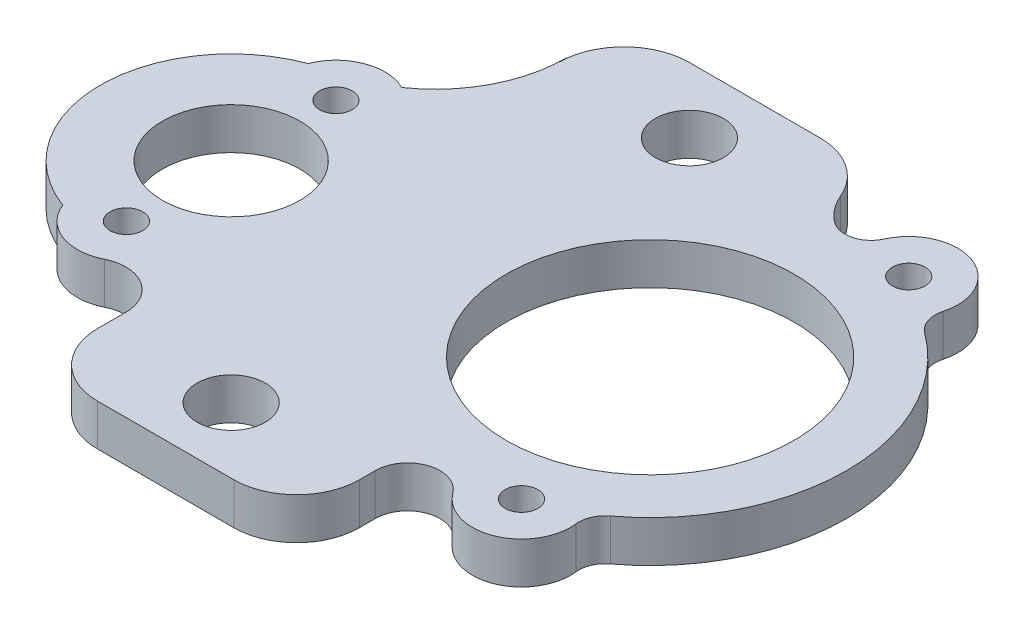
ISO-10303-21;
HEADER;
FILE_DESCRIPTION(('STEP AP214'),'2;1');
FILE_NAME('part.step','',(''),(''),'','','');
FILE_SCHEMA(('AUTOMOTIVE_DESIGN { 1 0 10303 214 1 1 1 1 }'));
ENDSEC;
DATA;
#1=APPLICATION_CONTEXT('core data for automotive mechanical design processes');
#2=APPLICATION_PROTOCOL_DEFINITION('international standard','automotive_design',2000,#1);
#3=PRODUCT_CONTEXT('',#1,'mechanical');
#4=PRODUCT('Part','Part','',(#3));
#5=PRODUCT_RELATED_PRODUCT_CATEGORY('part','',(#4));
#6=PRODUCT_DEFINITION_FORMATION('','',#4);
#7=PRODUCT_DEFINITION_CONTEXT('part definition',#1,'design');
#8=PRODUCT_DEFINITION('design','',#6,#7);
#9=PRODUCT_DEFINITION_SHAPE('','',#8);
#10=(LENGTH_UNIT() NAMED_UNIT(*) SI_UNIT(.MILLI.,.METRE.));
#11=(NAMED_UNIT(*) PLANE_ANGLE_UNIT() SI_UNIT($,.RADIAN.));
#12=(NAMED_UNIT(*) SI_UNIT($,.STERADIAN.) SOLID_ANGLE_UNIT());
#13=UNCERTAINTY_MEASURE_WITH_UNIT(LENGTH_MEASURE(1.E-05),#10,'distance_accuracy_value','');
#14=(GEOMETRIC_REPRESENTATION_CONTEXT(3) GLOBAL_UNCERTAINTY_ASSIGNED_CONTEXT((#13)) GLOBAL_UNIT_ASSIGNED_CONTEXT((#10,
#11,#12)) REPRESENTATION_CONTEXT('',''));
#15=CARTESIAN_POINT('',(0.,0.,0.));
#16=DIRECTION('',(0.,0.,1.));
#17=DIRECTION('',(1.,0.,0.));
#18=AXIS2_PLACEMENT_3D('',#15,#16,#17);
#19=CARTESIAN_POINT('',(14.9999999999998,69.9999999999997,131.043137062059));
#20=DIRECTION('',(0.,0.,-1.));
#21=DIRECTION('',(-1.,0.,0.));
#22=AXIS2_PLACEMENT_3D('',#19,#20,#21);
#23=PLANE('',#22);
#24=DIRECTION('',(-1.,0.,0.));
#25=VECTOR('',#24,1.);
#26=CARTESIAN_POINT('',(14.9999999999998,69.9999999999997,131.043137062059));
#27=LINE('',#26,#25);
#28=CARTESIAN_POINT('',(14.9999999999998,69.9999999999997,131.043137062059));
#29=VERTEX_POINT('',#28);
#30=CARTESIAN_POINT('',(4.99999999999983,69.9999999999997,131.043137062059));
#31=VERTEX_POINT('',#30);
#32=EDGE_CURVE('E678',#29,#31,#27,.T.);
#33=ORIENTED_EDGE('',*,*,#32,.T.);
#34=DIRECTION('',(0.,-1.,0.));
#35=VECTOR('',#34,1.);
#36=CARTESIAN_POINT('',(4.99999999999983,73.1749999999997,131.043137062059));
#37=LINE('',#36,#35);
#38=CARTESIAN_POINT('',(4.99999999999983,73.1749999999997,131.043137062059));
#39=VERTEX_POINT('',#38);
#40=EDGE_CURVE('E214',#39,#31,#37,.T.);
#41=ORIENTED_EDGE('',*,*,#40,.F.);
#42=DIRECTION('',(-1.,0.,0.));
#43=VECTOR('',#42,1.);
#44=CARTESIAN_POINT('',(14.9999999999998,73.1749999999996,131.043137062059));
#45=LINE('',#44,#43);
#46=CARTESIAN_POINT('',(14.9999999999998,73.1749999999996,131.043137062059));
#47=VERTEX_POINT('',#46);
#48=EDGE_CURVE('E213',#47,#39,#45,.T.);
#49=ORIENTED_EDGE('',*,*,#48,.F.);
#50=DIRECTION('',(0.,1.,0.));
#51=VECTOR('',#50,1.);
#52=CARTESIAN_POINT('',(14.9999999999998,69.9999999999997,131.043137062059));
#53=LINE('',#52,#51);
#54=EDGE_CURVE('E36',#29,#47,#53,.T.);
#55=ORIENTED_EDGE('',*,*,#54,.F.);
#56=EDGE_LOOP('',(#33,#41,#49,#55));
#57=FACE_BOUND('',#56,.T.);
#58=ADVANCED_FACE('F32',(#57),#23,.T.);
#59=CARTESIAN_POINT('',(14.9999999999998,69.9999999999997,136.043137062059));
#60=DIRECTION('',(0.,1.,0.));
#61=DIRECTION('',(0.,0.,1.));
#62=AXIS2_PLACEMENT_3D('',#59,#60,#61);
#63=CYLINDRICAL_SURFACE('',#62,5.00000000000006);
#64=CARTESIAN_POINT('',(14.9999999999998,73.1749999999996,136.043137062059));
#65=DIRECTION('',(0.,1.,0.));
#66=DIRECTION('',(0.,0.,1.));
#67=AXIS2_PLACEMENT_3D('',#64,#65,#66);
#68=CIRCLE('',#67,5.00000000000006);
#69=CARTESIAN_POINT('',(19.6147076746497,73.1749999999996,134.118436285958));
#70=VERTEX_POINT('',#69);
#71=EDGE_CURVE('E210',#70,#47,#68,.T.);
#72=ORIENTED_EDGE('',*,*,#71,.F.);
#73=DIRECTION('',(0.,1.,0.));
#74=VECTOR('',#73,1.);
#75=CARTESIAN_POINT('',(19.6147076746497,69.9999999999997,134.118436285958));
#76=LINE('',#75,#74);
#77=CARTESIAN_POINT('',(19.6147076746497,69.9999999999997,134.118436285958));
#78=VERTEX_POINT('',#77);
#79=EDGE_CURVE('E11',#78,#70,#76,.T.);
#80=ORIENTED_EDGE('',*,*,#79,.F.);
#81=CARTESIAN_POINT('',(14.9999999999998,69.9999999999997,136.043137062059));
#82=DIRECTION('',(0.,1.,0.));
#83=DIRECTION('',(0.,0.,1.));
#84=AXIS2_PLACEMENT_3D('',#81,#82,#83);
#85=CIRCLE('',#84,5.00000000000006);
#86=EDGE_CURVE('E266',#78,#29,#85,.T.);
#87=ORIENTED_EDGE('',*,*,#86,.T.);
#88=ORIENTED_EDGE('',*,*,#54,.T.);
#89=EDGE_LOOP('',(#72,#80,#87,#88));
#90=FACE_BOUND('',#89,.T.);
#91=ADVANCED_FACE('F34',(#90),#63,.T.);
#92=CARTESIAN_POINT('',(24.0448270423146,69.9999999999997,132.270723540901));
#93=DIRECTION('',(0.,1.,0.));
#94=DIRECTION('',(0.,0.,1.));
#95=AXIS2_PLACEMENT_3D('',#92,#93,#94);
#96=CYLINDRICAL_SURFACE('',#95,4.80000000000066);
#97=CARTESIAN_POINT('',(24.0448270423146,73.1749999999996,132.270723540901));
#98=DIRECTION('',(0.,-1.,0.));
#99=DIRECTION('',(0.,0.,-1.));
#100=AXIS2_PLACEMENT_3D('',#97,#98,#99);
#101=CIRCLE('',#100,4.80000000000066);
#102=CARTESIAN_POINT('',(21.0461776652767,73.1749999999996,136.018803304407));
#103=VERTEX_POINT('',#102);
#104=EDGE_CURVE('E264',#103,#70,#101,.T.);
#105=ORIENTED_EDGE('',*,*,#104,.F.);
#106=DIRECTION('',(0.,1.,0.));
#107=VECTOR('',#106,1.);
#108=CARTESIAN_POINT('',(21.0461776652767,69.9999999999997,136.018803304407));
#109=LINE('',#108,#107);
#110=CARTESIAN_POINT('',(21.0461776652767,69.9999999999997,136.018803304407));
#111=VERTEX_POINT('',#110);
#112=EDGE_CURVE('E41',#111,#103,#109,.T.);
#113=ORIENTED_EDGE('',*,*,#112,.F.);
#114=CARTESIAN_POINT('',(24.0448270423146,69.9999999999997,132.270723540901));
#115=DIRECTION('',(0.,-1.,0.));
#116=DIRECTION('',(0.,0.,-1.));
#117=AXIS2_PLACEMENT_3D('',#114,#115,#116);
#118=CIRCLE('',#117,4.80000000000066);
#119=EDGE_CURVE('E200',#111,#78,#118,.T.);
#120=ORIENTED_EDGE('',*,*,#119,.T.);
#121=ORIENTED_EDGE('',*,*,#79,.T.);
#122=EDGE_LOOP('',(#105,#113,#120,#121));
#123=FACE_BOUND('',#122,.T.);
#124=ADVANCED_FACE('F306',(#123),#96,.F.);
#125=CARTESIAN_POINT('',(22.2956149057087,69.9999999999997,134.457103402946));
#126=DIRECTION('',(0.,1.,0.));
#127=DIRECTION('',(0.,0.,1.));
#128=AXIS2_PLACEMENT_3D('',#125,#126,#127);
#129=CYLINDRICAL_SURFACE('',#128,2.00000000000011);
#130=CARTESIAN_POINT('',(22.2956149057087,73.1749999999996,134.457103402946));
#131=DIRECTION('',(0.,-1.,0.));
#132=DIRECTION('',(0.,0.,-1.));
#133=AXIS2_PLACEMENT_3D('',#130,#131,#132);
#134=CIRCLE('',#133,2.00000000000011);
#135=CARTESIAN_POINT('',(24.1176951087348,73.1749999999996,135.281738918638));
#136=VERTEX_POINT('',#135);
#137=EDGE_CURVE('E186',#136,#103,#134,.T.);
#138=ORIENTED_EDGE('',*,*,#137,.F.);
#139=DIRECTION('',(0.,1.,0.));
#140=VECTOR('',#139,1.);
#141=CARTESIAN_POINT('',(24.1176951087348,69.9999999999997,135.281738918638));
#142=LINE('',#141,#140);
#143=CARTESIAN_POINT('',(24.1176951087348,69.9999999999997,135.281738918638));
#144=VERTEX_POINT('',#143);
#145=EDGE_CURVE('E180',#144,#136,#142,.T.);
#146=ORIENTED_EDGE('',*,*,#145,.F.);
#147=CARTESIAN_POINT('',(22.2956149057087,69.9999999999997,134.457103402946));
#148=DIRECTION('',(0.,-1.,0.));
#149=DIRECTION('',(0.,0.,-1.));
#150=AXIS2_PLACEMENT_3D('',#147,#148,#149);
#151=CIRCLE('',#150,2.00000000000011);
#152=EDGE_CURVE('E183',#144,#111,#151,.T.);
#153=ORIENTED_EDGE('',*,*,#152,.T.);
#154=ORIENTED_EDGE('',*,*,#112,.T.);
#155=EDGE_LOOP('',(#138,#146,#153,#154));
#156=FACE_BOUND('',#155,.T.);
#157=ADVANCED_FACE('F182',(#156),#129,.F.);
#158=CARTESIAN_POINT('',(27.5340954894091,69.9999999999997,136.827930510559));
#159=DIRECTION('',(0.,1.,0.));
#160=DIRECTION('',(0.,0.,1.));
#161=AXIS2_PLACEMENT_3D('',#158,#159,#160);
#162=CYLINDRICAL_SURFACE('',#161,3.74999999999996);
#163=CARTESIAN_POINT('',(27.5340954894091,73.1749999999996,136.827930510559));
#164=DIRECTION('',(0.,1.,0.));
#165=DIRECTION('',(0.,0.,1.));
#166=AXIS2_PLACEMENT_3D('',#163,#164,#165);
#167=CIRCLE('',#166,3.74999999999996);
#168=CARTESIAN_POINT('',(31.1498493593787,73.1749999999996,137.822326785593));
#169=VERTEX_POINT('',#168);
#170=EDGE_CURVE('E261',#169,#136,#167,.T.);
#171=ORIENTED_EDGE('',*,*,#170,.F.);
#172=DIRECTION('',(0.,1.,0.));
#173=VECTOR('',#172,1.);
#174=CARTESIAN_POINT('',(31.1498493593787,69.9999999999997,137.822326785593));
#175=LINE('',#174,#173);
#176=CARTESIAN_POINT('',(31.1498493593787,69.9999999999997,137.822326785593));
#177=VERTEX_POINT('',#176);
#178=EDGE_CURVE('E191',#177,#169,#175,.T.);
#179=ORIENTED_EDGE('',*,*,#178,.F.);
#180=CARTESIAN_POINT('',(27.5340954894091,69.9999999999997,136.827930510559));
#181=DIRECTION('',(0.,1.,0.));
#182=DIRECTION('',(0.,0.,1.));
#183=AXIS2_PLACEMENT_3D('',#180,#181,#182);
#184=CIRCLE('',#183,3.74999999999996);
#185=EDGE_CURVE('E198',#177,#144,#184,.T.);
#186=ORIENTED_EDGE('',*,*,#185,.T.);
#187=ORIENTED_EDGE('',*,*,#145,.T.);
#188=EDGE_LOOP('',(#171,#179,#186,#187));
#189=FACE_BOUND('',#188,.T.);
#190=ADVANCED_FACE('F202',(#189),#162,.T.);
#191=CARTESIAN_POINT('',(33.0782514233622,69.9999999999997,138.352671465612));
#192=DIRECTION('',(0.,1.,0.));
#193=DIRECTION('',(0.,0.,1.));
#194=AXIS2_PLACEMENT_3D('',#191,#192,#193);
#195=CYLINDRICAL_SURFACE('',#194,1.99999999999997);
#196=CARTESIAN_POINT('',(33.0782514233622,73.1749999999996,138.352671465612));
#197=DIRECTION('',(0.,-1.,0.));
#198=DIRECTION('',(0.,0.,-1.));
#199=AXIS2_PLACEMENT_3D('',#196,#197,#198);
#200=CIRCLE('',#199,1.99999999999997);
#201=CARTESIAN_POINT('',(31.8925747853198,73.1749999999996,139.963314476958));
#202=VERTEX_POINT('',#201);
#203=EDGE_CURVE('E258',#202,#169,#200,.T.);
#204=ORIENTED_EDGE('',*,*,#203,.F.);
#205=DIRECTION('',(0.,1.,0.));
#206=VECTOR('',#205,1.);
#207=CARTESIAN_POINT('',(31.8925747853198,69.9999999999997,139.963314476958));
#208=LINE('',#207,#206);
#209=CARTESIAN_POINT('',(31.8925747853198,69.9999999999997,139.963314476958));
#210=VERTEX_POINT('',#209);
#211=EDGE_CURVE('E270',#210,#202,#208,.T.);
#212=ORIENTED_EDGE('',*,*,#211,.F.);
#213=CARTESIAN_POINT('',(33.0782514233622,69.9999999999997,138.352671465612));
#214=DIRECTION('',(0.,-1.,0.));
#215=DIRECTION('',(0.,0.,-1.));
#216=AXIS2_PLACEMENT_3D('',#213,#214,#215);
#217=CIRCLE('',#216,1.99999999999997);
#218=EDGE_CURVE('E203',#210,#177,#217,.T.);
#219=ORIENTED_EDGE('',*,*,#218,.T.);
#220=ORIENTED_EDGE('',*,*,#178,.T.);
#221=EDGE_LOOP('',(#204,#212,#219,#220));
#222=FACE_BOUND('',#221,.T.);
#223=ADVANCED_FACE('F373',(#222),#195,.F.);
#224=CARTESIAN_POINT('',(22.9999999999999,69.9999999999997,152.043137062058));
#225=DIRECTION('',(0.,1.,0.));
#226=DIRECTION('',(0.,0.,1.));
#227=AXIS2_PLACEMENT_3D('',#224,#225,#226);
#228=CYLINDRICAL_SURFACE('',#227,14.9999999999999);
#229=CARTESIAN_POINT('',(22.9999999999999,73.1749999999996,152.043137062058));
#230=DIRECTION('',(0.,1.,0.));
#231=DIRECTION('',(0.,0.,1.));
#232=AXIS2_PLACEMENT_3D('',#229,#230,#231);
#233=CIRCLE('',#232,14.9999999999999);
#234=CARTESIAN_POINT('',(31.9786986541308,73.1749999999996,164.059083569858));
#235=VERTEX_POINT('',#234);
#236=EDGE_CURVE('E255',#235,#202,#233,.T.);
#237=ORIENTED_EDGE('',*,*,#236,.F.);
#238=DIRECTION('',(0.,1.,0.));
#239=VECTOR('',#238,1.);
#240=CARTESIAN_POINT('',(31.9786986541308,69.9999999999997,164.059083569858));
#241=LINE('',#240,#239);
#242=CARTESIAN_POINT('',(31.9786986541308,69.9999999999997,164.059083569858));
#243=VERTEX_POINT('',#242);
#244=EDGE_CURVE('E272',#243,#235,#241,.T.);
#245=ORIENTED_EDGE('',*,*,#244,.F.);
#246=CARTESIAN_POINT('',(22.9999999999999,69.9999999999997,152.043137062058));
#247=DIRECTION('',(0.,1.,0.));
#248=DIRECTION('',(0.,0.,1.));
#249=AXIS2_PLACEMENT_3D('',#246,#247,#248);
#250=CIRCLE('',#249,14.9999999999999);
#251=EDGE_CURVE('E205',#243,#210,#250,.T.);
#252=ORIENTED_EDGE('',*,*,#251,.T.);
#253=ORIENTED_EDGE('',*,*,#211,.T.);
#254=EDGE_LOOP('',(#237,#245,#252,#253));
#255=FACE_BOUND('',#254,.T.);
#256=ADVANCED_FACE('F369',(#255),#228,.T.);
#257=CARTESIAN_POINT('',(33.1758584746817,69.9999999999997,165.661209770898));
#258=DIRECTION('',(0.,1.,0.));
#259=DIRECTION('',(0.,0.,1.));
#260=AXIS2_PLACEMENT_3D('',#257,#258,#259);
#261=CYLINDRICAL_SURFACE('',#260,2.00000000000009);
#262=CARTESIAN_POINT('',(33.1758584746817,73.1749999999996,165.661209770898));
#263=DIRECTION('',(0.,-1.,0.));
#264=DIRECTION('',(0.,0.,-1.));
#265=AXIS2_PLACEMENT_3D('',#262,#263,#264);
#266=CIRCLE('',#265,2.00000000000009);
#267=CARTESIAN_POINT('',(31.1894987713888,73.1749999999996,165.894394524121));
#268=VERTEX_POINT('',#267);
#269=EDGE_CURVE('E252',#268,#235,#266,.T.);
#270=ORIENTED_EDGE('',*,*,#269,.F.);
#271=DIRECTION('',(0.,1.,0.));
#272=VECTOR('',#271,1.);
#273=CARTESIAN_POINT('',(31.1894987713888,69.9999999999997,165.894394524121));
#274=LINE('',#273,#272);
#275=CARTESIAN_POINT('',(31.1894987713888,69.9999999999997,165.894394524121));
#276=VERTEX_POINT('',#275);
#277=EDGE_CURVE('E274',#276,#268,#274,.T.);
#278=ORIENTED_EDGE('',*,*,#277,.F.);
#279=CARTESIAN_POINT('',(33.1758584746817,69.9999999999997,165.661209770898));
#280=DIRECTION('',(0.,-1.,0.));
#281=DIRECTION('',(0.,0.,-1.));
#282=AXIS2_PLACEMENT_3D('',#279,#280,#281);
#283=CIRCLE('',#282,2.00000000000009);
#284=EDGE_CURVE('E715',#276,#243,#283,.T.);
#285=ORIENTED_EDGE('',*,*,#284,.T.);
#286=ORIENTED_EDGE('',*,*,#244,.T.);
#287=EDGE_LOOP('',(#270,#278,#285,#286));
#288=FACE_BOUND('',#287,.T.);
#289=ADVANCED_FACE('F365',(#288),#261,.F.);
#290=CARTESIAN_POINT('',(27.4650743277155,69.9999999999997,166.331615936413));
#291=DIRECTION('',(0.,1.,0.));
#292=DIRECTION('',(0.,0.,1.));
#293=AXIS2_PLACEMENT_3D('',#290,#291,#292);
#294=CYLINDRICAL_SURFACE('',#293,3.74999999999975);
#295=CARTESIAN_POINT('',(27.4650743277155,73.1749999999996,166.331615936413));
#296=DIRECTION('',(0.,1.,0.));
#297=DIRECTION('',(0.,0.,1.));
#298=AXIS2_PLACEMENT_3D('',#295,#296,#297);
#299=CIRCLE('',#298,3.74999999999975);
#300=CARTESIAN_POINT('',(24.4525362051228,73.1749999999996,168.564800671253));
#301=VERTEX_POINT('',#300);
#302=EDGE_CURVE('E249',#301,#268,#299,.T.);
#303=ORIENTED_EDGE('',*,*,#302,.F.);
#304=DIRECTION('',(0.,1.,0.));
#305=VECTOR('',#304,1.);
#306=CARTESIAN_POINT('',(24.4525362051228,69.9999999999997,168.564800671253));
#307=LINE('',#306,#305);
#308=CARTESIAN_POINT('',(24.4525362051228,69.9999999999997,168.564800671253));
#309=VERTEX_POINT('',#308);
#310=EDGE_CURVE('E276',#309,#301,#307,.T.);
#311=ORIENTED_EDGE('',*,*,#310,.F.);
#312=CARTESIAN_POINT('',(27.4650743277155,69.9999999999997,166.331615936413));
#313=DIRECTION('',(0.,1.,0.));
#314=DIRECTION('',(0.,0.,1.));
#315=AXIS2_PLACEMENT_3D('',#312,#313,#314);
#316=CIRCLE('',#315,3.74999999999975);
#317=EDGE_CURVE('E712',#309,#276,#316,.T.);
#318=ORIENTED_EDGE('',*,*,#317,.T.);
#319=ORIENTED_EDGE('',*,*,#277,.T.);
#320=EDGE_LOOP('',(#303,#311,#318,#319));
#321=FACE_BOUND('',#320,.T.);
#322=ADVANCED_FACE('F361',(#321),#294,.T.);
#323=CARTESIAN_POINT('',(22.4689677153948,69.9999999999997,170.035213556173));
#324=DIRECTION('',(0.,1.,0.));
#325=DIRECTION('',(0.,0.,1.));
#326=AXIS2_PLACEMENT_3D('',#323,#324,#325);
#327=CYLINDRICAL_SURFACE('',#326,2.46914114735876);
#328=CARTESIAN_POINT('',(22.4689677153948,73.1749999999996,170.035213556173));
#329=DIRECTION('',(0.,-1.,0.));
#330=DIRECTION('',(0.,0.,-1.));
#331=AXIS2_PLACEMENT_3D('',#328,#329,#330);
#332=CIRCLE('',#331,2.46914114735876);
#333=CARTESIAN_POINT('',(19.9999999999997,73.1749999999996,170.064478311714));
#334=VERTEX_POINT('',#333);
#335=EDGE_CURVE('E246',#334,#301,#332,.T.);
#336=ORIENTED_EDGE('',*,*,#335,.F.);
#337=DIRECTION('',(0.,1.,0.));
#338=VECTOR('',#337,1.);
#339=CARTESIAN_POINT('',(19.9999999999997,69.9999999999997,170.064478311714));
#340=LINE('',#339,#338);
#341=CARTESIAN_POINT('',(19.9999999999997,69.9999999999997,170.064478311714));
#342=VERTEX_POINT('',#341);
#343=EDGE_CURVE('E278',#342,#334,#340,.T.);
#344=ORIENTED_EDGE('',*,*,#343,.F.);
#345=CARTESIAN_POINT('',(22.4689677153948,69.9999999999997,170.035213556173));
#346=DIRECTION('',(0.,-1.,0.));
#347=DIRECTION('',(0.,0.,-1.));
#348=AXIS2_PLACEMENT_3D('',#345,#346,#347);
#349=CIRCLE('',#348,2.46914114735876);
#350=EDGE_CURVE('E709',#342,#309,#349,.T.);
#351=ORIENTED_EDGE('',*,*,#350,.T.);
#352=ORIENTED_EDGE('',*,*,#310,.T.);
#353=EDGE_LOOP('',(#336,#344,#351,#352));
#354=FACE_BOUND('',#353,.T.);
#355=ADVANCED_FACE('F357',(#354),#327,.F.);
#356=CARTESIAN_POINT('',(19.9999999999998,69.9999999999997,171.243137062062));
#357=DIRECTION('',(1.,0.,0.));
#358=DIRECTION('',(0.,0.,-1.));
#359=AXIS2_PLACEMENT_3D('',#356,#357,#358);
#360=PLANE('',#359);
#361=DIRECTION('',(0.,0.,-1.));
#362=VECTOR('',#361,1.);
#363=CARTESIAN_POINT('',(19.9999999999998,73.1749999999996,171.243137062062));
#364=LINE('',#363,#362);
#365=CARTESIAN_POINT('',(19.9999999999998,73.1749999999996,171.243137062062));
#366=VERTEX_POINT('',#365);
#367=EDGE_CURVE('E243',#366,#334,#364,.T.);
#368=ORIENTED_EDGE('',*,*,#367,.F.);
#369=DIRECTION('',(0.,1.,0.));
#370=VECTOR('',#369,1.);
#371=CARTESIAN_POINT('',(19.9999999999998,69.9999999999997,171.243137062062));
#372=LINE('',#371,#370);
#373=CARTESIAN_POINT('',(19.9999999999998,69.9999999999997,171.243137062062));
#374=VERTEX_POINT('',#373);
#375=EDGE_CURVE('E280',#374,#366,#372,.T.);
#376=ORIENTED_EDGE('',*,*,#375,.F.);
#377=DIRECTION('',(0.,0.,-1.));
#378=VECTOR('',#377,1.);
#379=CARTESIAN_POINT('',(19.9999999999998,69.9999999999997,171.243137062062));
#380=LINE('',#379,#378);
#381=EDGE_CURVE('E706',#374,#342,#380,.T.);
#382=ORIENTED_EDGE('',*,*,#381,.T.);
#383=ORIENTED_EDGE('',*,*,#343,.T.);
#384=EDGE_LOOP('',(#368,#376,#382,#383));
#385=FACE_BOUND('',#384,.T.);
#386=ADVANCED_FACE('F353',(#385),#360,.T.);
#387=CARTESIAN_POINT('',(15.1999999999998,69.9999999999997,171.243137062062));
#388=DIRECTION('',(0.,1.,0.));
#389=DIRECTION('',(0.,0.,1.));
#390=AXIS2_PLACEMENT_3D('',#387,#388,#389);
#391=CYLINDRICAL_SURFACE('',#390,4.8);
#392=CARTESIAN_POINT('',(15.1999999999998,73.1749999999996,171.243137062062));
#393=DIRECTION('',(0.,1.,0.));
#394=DIRECTION('',(0.,0.,1.));
#395=AXIS2_PLACEMENT_3D('',#392,#393,#394);
#396=CIRCLE('',#395,4.8);
#397=CARTESIAN_POINT('',(15.1999999999998,73.1749999999996,176.043137062062));
#398=VERTEX_POINT('',#397);
#399=EDGE_CURVE('E240',#398,#366,#396,.T.);
#400=ORIENTED_EDGE('',*,*,#399,.F.);
#401=DIRECTION('',(0.,1.,0.));
#402=VECTOR('',#401,1.);
#403=CARTESIAN_POINT('',(15.1999999999998,69.9999999999997,176.043137062062));
#404=LINE('',#403,#402);
#405=CARTESIAN_POINT('',(15.1999999999998,69.9999999999997,176.043137062062));
#406=VERTEX_POINT('',#405);
#407=EDGE_CURVE('E282',#406,#398,#404,.T.);
#408=ORIENTED_EDGE('',*,*,#407,.F.);
#409=CARTESIAN_POINT('',(15.1999999999998,69.9999999999997,171.243137062062));
#410=DIRECTION('',(0.,1.,0.));
#411=DIRECTION('',(0.,0.,1.));
#412=AXIS2_PLACEMENT_3D('',#409,#410,#411);
#413=CIRCLE('',#412,4.8);
#414=EDGE_CURVE('E703',#406,#374,#413,.T.);
#415=ORIENTED_EDGE('',*,*,#414,.T.);
#416=ORIENTED_EDGE('',*,*,#375,.T.);
#417=EDGE_LOOP('',(#400,#408,#415,#416));
#418=FACE_BOUND('',#417,.T.);
#419=ADVANCED_FACE('F349',(#418),#391,.T.);
#420=CARTESIAN_POINT('',(4.79999999999983,69.9999999999997,176.043137062062));
#421=DIRECTION('',(0.,0.,1.));
#422=DIRECTION('',(1.,0.,0.));
#423=AXIS2_PLACEMENT_3D('',#420,#421,#422);
#424=PLANE('',#423);
#425=DIRECTION('',(1.,0.,0.));
#426=VECTOR('',#425,1.);
#427=CARTESIAN_POINT('',(4.79999999999983,73.1749999999996,176.043137062062));
#428=LINE('',#427,#426);
#429=CARTESIAN_POINT('',(4.79999999999983,73.1749999999996,176.043137062062));
#430=VERTEX_POINT('',#429);
#431=EDGE_CURVE('E237',#430,#398,#428,.T.);
#432=ORIENTED_EDGE('',*,*,#431,.F.);
#433=DIRECTION('',(0.,1.,0.));
#434=VECTOR('',#433,1.);
#435=CARTESIAN_POINT('',(4.79999999999983,69.9999999999997,176.043137062062));
#436=LINE('',#435,#434);
#437=CARTESIAN_POINT('',(4.79999999999983,69.9999999999997,176.043137062062));
#438=VERTEX_POINT('',#437);
#439=EDGE_CURVE('E284',#438,#430,#436,.T.);
#440=ORIENTED_EDGE('',*,*,#439,.F.);
#441=DIRECTION('',(1.,0.,0.));
#442=VECTOR('',#441,1.);
#443=CARTESIAN_POINT('',(4.79999999999983,69.9999999999997,176.043137062062));
#444=LINE('',#443,#442);
#445=EDGE_CURVE('E700',#438,#406,#444,.T.);
#446=ORIENTED_EDGE('',*,*,#445,.T.);
#447=ORIENTED_EDGE('',*,*,#407,.T.);
#448=EDGE_LOOP('',(#432,#440,#446,#447));
#449=FACE_BOUND('',#448,.T.);
#450=ADVANCED_FACE('F345',(#449),#424,.T.);
#451=CARTESIAN_POINT('',(4.79999999999982,69.9999999999997,171.243137062062));
#452=DIRECTION('',(0.,1.,0.));
#453=DIRECTION('',(0.,0.,1.));
#454=AXIS2_PLACEMENT_3D('',#451,#452,#453);
#455=CYLINDRICAL_SURFACE('',#454,4.8);
#456=CARTESIAN_POINT('',(4.79999999999982,73.1749999999996,171.243137062062));
#457=DIRECTION('',(0.,1.,0.));
#458=DIRECTION('',(0.,0.,1.));
#459=AXIS2_PLACEMENT_3D('',#456,#457,#458);
#460=CIRCLE('',#459,4.8);
#461=CARTESIAN_POINT('',(-1.75207071073658E-13,73.1749999999996,171.243137062062));
#462=VERTEX_POINT('',#461);
#463=EDGE_CURVE('E234',#462,#430,#460,.T.);
#464=ORIENTED_EDGE('',*,*,#463,.F.);
#465=DIRECTION('',(0.,1.,0.));
#466=VECTOR('',#465,1.);
#467=CARTESIAN_POINT('',(-1.75207071073658E-13,69.9999999999997,171.243137062062));
#468=LINE('',#467,#466);
#469=CARTESIAN_POINT('',(-1.75207071073658E-13,69.9999999999997,171.243137062062));
#470=VERTEX_POINT('',#469);
#471=EDGE_CURVE('E286',#470,#462,#468,.T.);
#472=ORIENTED_EDGE('',*,*,#471,.F.);
#473=CARTESIAN_POINT('',(4.79999999999982,69.9999999999997,171.243137062062));
#474=DIRECTION('',(0.,1.,0.));
#475=DIRECTION('',(0.,0.,1.));
#476=AXIS2_PLACEMENT_3D('',#473,#474,#475);
#477=CIRCLE('',#476,4.8);
#478=EDGE_CURVE('E697',#470,#438,#477,.T.);
#479=ORIENTED_EDGE('',*,*,#478,.T.);
#480=ORIENTED_EDGE('',*,*,#439,.T.);
#481=EDGE_LOOP('',(#464,#472,#479,#480));
#482=FACE_BOUND('',#481,.T.);
#483=ADVANCED_FACE('F341',(#482),#455,.T.);
#484=CARTESIAN_POINT('',(-1.73116729285106E-13,69.9999999999997,169.066324625279));
#485=DIRECTION('',(-1.,0.,0.));
#486=DIRECTION('',(0.,0.,1.));
#487=AXIS2_PLACEMENT_3D('',#484,#485,#486);
#488=PLANE('',#487);
#489=DIRECTION('',(0.,0.,1.));
#490=VECTOR('',#489,1.);
#491=CARTESIAN_POINT('',(-1.73116729285106E-13,73.1749999999996,169.066324625279));
#492=LINE('',#491,#490);
#493=CARTESIAN_POINT('',(-1.68701858038744E-13,73.1749999999996,169.066324625279));
#494=VERTEX_POINT('',#493);
#495=EDGE_CURVE('E231',#494,#462,#492,.T.);
#496=ORIENTED_EDGE('',*,*,#495,.F.);
#497=DIRECTION('',(0.,1.,0.));
#498=VECTOR('',#497,1.);
#499=CARTESIAN_POINT('',(-1.68701858038744E-13,69.9999999999997,169.066324625279));
#500=LINE('',#499,#498);
#501=CARTESIAN_POINT('',(-1.68701858038744E-13,69.9999999999997,169.066324625279));
#502=VERTEX_POINT('',#501);
#503=EDGE_CURVE('E288',#502,#494,#500,.T.);
#504=ORIENTED_EDGE('',*,*,#503,.F.);
#505=DIRECTION('',(0.,0.,1.));
#506=VECTOR('',#505,1.);
#507=CARTESIAN_POINT('',(-1.73116729285106E-13,69.9999999999997,169.066324625279));
#508=LINE('',#507,#506);
#509=EDGE_CURVE('E694',#502,#470,#508,.T.);
#510=ORIENTED_EDGE('',*,*,#509,.T.);
#511=ORIENTED_EDGE('',*,*,#471,.T.);
#512=EDGE_LOOP('',(#496,#504,#510,#511));
#513=FACE_BOUND('',#512,.T.);
#514=ADVANCED_FACE('F337',(#513),#488,.T.);
#515=CARTESIAN_POINT('',(-2.99700866872108,69.9999999999997,169.08507053944));
#516=DIRECTION('',(0.,1.,0.));
#517=DIRECTION('',(0.,0.,1.));
#518=AXIS2_PLACEMENT_3D('',#515,#516,#517);
#519=CYLINDRICAL_SURFACE('',#518,2.99706729482106);
#520=CARTESIAN_POINT('',(-2.99700866872108,73.1749999999996,169.08507053944));
#521=DIRECTION('',(0.,-1.,0.));
#522=DIRECTION('',(0.,0.,-1.));
#523=AXIS2_PLACEMENT_3D('',#520,#521,#522);
#524=CIRCLE('',#523,2.99706729482106);
#525=CARTESIAN_POINT('',(-4.33094632079063,73.1749999999996,166.401225776776));
#526=VERTEX_POINT('',#525);
#527=EDGE_CURVE('E228',#526,#494,#524,.T.);
#528=ORIENTED_EDGE('',*,*,#527,.F.);
#529=DIRECTION('',(0.,1.,0.));
#530=VECTOR('',#529,1.);
#531=CARTESIAN_POINT('',(-4.33094632079063,69.9999999999997,166.401225776776));
#532=LINE('',#531,#530);
#533=CARTESIAN_POINT('',(-4.33094632079063,69.9999999999997,166.401225776776));
#534=VERTEX_POINT('',#533);
#535=EDGE_CURVE('E290',#534,#526,#532,.T.);
#536=ORIENTED_EDGE('',*,*,#535,.F.);
#537=CARTESIAN_POINT('',(-2.99700866872108,69.9999999999997,169.08507053944));
#538=DIRECTION('',(0.,-1.,0.));
#539=DIRECTION('',(0.,0.,-1.));
#540=AXIS2_PLACEMENT_3D('',#537,#538,#539);
#541=CIRCLE('',#540,2.99706729482106);
#542=EDGE_CURVE('E691',#534,#502,#541,.T.);
#543=ORIENTED_EDGE('',*,*,#542,.T.);
#544=ORIENTED_EDGE('',*,*,#503,.T.);
#545=EDGE_LOOP('',(#528,#536,#543,#544));
#546=FACE_BOUND('',#545,.T.);
#547=ADVANCED_FACE('F333',(#546),#519,.F.);
#548=CARTESIAN_POINT('',(-6.00000000000038,69.9999999999997,163.043137062058));
#549=DIRECTION('',(0.,1.,0.));
#550=DIRECTION('',(0.,0.,1.));
#551=AXIS2_PLACEMENT_3D('',#548,#549,#550);
#552=CYLINDRICAL_SURFACE('',#551,3.75000000000028);
#553=CARTESIAN_POINT('',(-6.00000000000038,73.1749999999996,163.043137062058));
#554=DIRECTION('',(0.,1.,0.));
#555=DIRECTION('',(0.,0.,1.));
#556=AXIS2_PLACEMENT_3D('',#553,#554,#555);
#557=CIRCLE('',#556,3.75000000000028);
#558=CARTESIAN_POINT('',(-9.49035842410423,73.1749999999996,164.414230812058));
#559=VERTEX_POINT('',#558);
#560=EDGE_CURVE('E225',#559,#526,#557,.T.);
#561=ORIENTED_EDGE('',*,*,#560,.F.);
#562=DIRECTION('',(0.,1.,0.));
#563=VECTOR('',#562,1.);
#564=CARTESIAN_POINT('',(-9.49035842410423,69.9999999999997,164.414230812058));
#565=LINE('',#564,#563);
#566=CARTESIAN_POINT('',(-9.49035842410423,69.9999999999997,164.414230812058));
#567=VERTEX_POINT('',#566);
#568=EDGE_CURVE('E292',#567,#559,#565,.T.);
#569=ORIENTED_EDGE('',*,*,#568,.F.);
#570=CARTESIAN_POINT('',(-6.00000000000038,69.9999999999997,163.043137062058));
#571=DIRECTION('',(0.,1.,0.));
#572=DIRECTION('',(0.,0.,1.));
#573=AXIS2_PLACEMENT_3D('',#570,#571,#572);
#574=CIRCLE('',#573,3.75000000000028);
#575=EDGE_CURVE('E688',#567,#534,#574,.T.);
#576=ORIENTED_EDGE('',*,*,#575,.T.);
#577=ORIENTED_EDGE('',*,*,#535,.T.);
#578=EDGE_LOOP('',(#561,#569,#576,#577));
#579=FACE_BOUND('',#578,.T.);
#580=ADVANCED_FACE('F329',(#579),#552,.T.);
#581=CARTESIAN_POINT('',(-6.00000000000038,69.9999999999997,155.043137062058));
#582=DIRECTION('',(0.,1.,0.));
#583=DIRECTION('',(0.,0.,1.));
#584=AXIS2_PLACEMENT_3D('',#581,#582,#583);
#585=CYLINDRICAL_SURFACE('',#584,10.0000000000001);
#586=CARTESIAN_POINT('',(-6.00000000000038,73.1749999999996,155.043137062058));
#587=DIRECTION('',(0.,1.,0.));
#588=DIRECTION('',(0.,0.,1.));
#589=AXIS2_PLACEMENT_3D('',#586,#587,#588);
#590=CIRCLE('',#589,10.0000000000001);
#591=CARTESIAN_POINT('',(-9.49035842410314,73.1749999999996,145.672043312058));
#592=VERTEX_POINT('',#591);
#593=EDGE_CURVE('E222',#592,#559,#590,.T.);
#594=ORIENTED_EDGE('',*,*,#593,.F.);
#595=DIRECTION('',(0.,1.,0.));
#596=VECTOR('',#595,1.);
#597=CARTESIAN_POINT('',(-9.49035842410314,69.9999999999997,145.672043312058));
#598=LINE('',#597,#596);
#599=CARTESIAN_POINT('',(-9.49035842410314,69.9999999999997,145.672043312058));
#600=VERTEX_POINT('',#599);
#601=EDGE_CURVE('E294',#600,#592,#598,.T.);
#602=ORIENTED_EDGE('',*,*,#601,.F.);
#603=CARTESIAN_POINT('',(-6.00000000000038,69.9999999999997,155.043137062058));
#604=DIRECTION('',(0.,1.,0.));
#605=DIRECTION('',(0.,0.,1.));
#606=AXIS2_PLACEMENT_3D('',#603,#604,#605);
#607=CIRCLE('',#606,10.0000000000001);
#608=EDGE_CURVE('E685',#600,#567,#607,.T.);
#609=ORIENTED_EDGE('',*,*,#608,.T.);
#610=ORIENTED_EDGE('',*,*,#568,.T.);
#611=EDGE_LOOP('',(#594,#602,#609,#610));
#612=FACE_BOUND('',#611,.T.);
#613=ADVANCED_FACE('F325',(#612),#585,.T.);
#614=CARTESIAN_POINT('',(-6.00000000000038,69.9999999999997,147.043137062058));
#615=DIRECTION('',(0.,1.,0.));
#616=DIRECTION('',(0.,0.,1.));
#617=AXIS2_PLACEMENT_3D('',#614,#615,#616);
#618=CYLINDRICAL_SURFACE('',#617,3.7499999999993);
#619=CARTESIAN_POINT('',(-6.00000000000038,73.1749999999996,147.043137062058));
#620=DIRECTION('',(0.,1.,0.));
#621=DIRECTION('',(0.,0.,1.));
#622=AXIS2_PLACEMENT_3D('',#619,#620,#621);
#623=CIRCLE('',#622,3.7499999999993);
#624=CARTESIAN_POINT('',(-4.33094632079044,73.1749999999996,143.685048347341));
#625=VERTEX_POINT('',#624);
#626=EDGE_CURVE('E219',#625,#592,#623,.T.);
#627=ORIENTED_EDGE('',*,*,#626,.F.);
#628=DIRECTION('',(0.,1.,0.));
#629=VECTOR('',#628,1.);
#630=CARTESIAN_POINT('',(-4.33094632079044,69.9999999999997,143.685048347341));
#631=LINE('',#630,#629);
#632=CARTESIAN_POINT('',(-4.33094632079044,69.9999999999997,143.685048347341));
#633=VERTEX_POINT('',#632);
#634=EDGE_CURVE('E295',#633,#625,#631,.T.);
#635=ORIENTED_EDGE('',*,*,#634,.F.);
#636=CARTESIAN_POINT('',(-6.00000000000038,69.9999999999997,147.043137062058));
#637=DIRECTION('',(0.,1.,0.));
#638=DIRECTION('',(0.,0.,1.));
#639=AXIS2_PLACEMENT_3D('',#636,#637,#638);
#640=CIRCLE('',#639,3.7499999999993);
#641=EDGE_CURVE('E682',#633,#600,#640,.T.);
#642=ORIENTED_EDGE('',*,*,#641,.T.);
#643=ORIENTED_EDGE('',*,*,#601,.T.);
#644=EDGE_LOOP('',(#627,#635,#642,#643));
#645=FACE_BOUND('',#644,.T.);
#646=ADVANCED_FACE('F322',(#645),#618,.T.);
#647=CARTESIAN_POINT('',(-10.0000000000002,69.9999999999997,135.447219119793));
#648=DIRECTION('',(0.,1.,0.));
#649=DIRECTION('',(0.,0.,1.));
#650=AXIS2_PLACEMENT_3D('',#647,#648,#649);
#651=CYLINDRICAL_SURFACE('',#650,10.0000000000003);
#652=DIRECTION('',(0.,-1.,0.));
#653=VECTOR('',#652,1.);
#654=CARTESIAN_POINT('',(0.,73.1749999999997,135.447219119793));
#655=LINE('',#654,#653);
#656=CARTESIAN_POINT('',(0.,73.1749999999996,135.447219119795));
#657=VERTEX_POINT('',#656);
#658=CARTESIAN_POINT('',(0.,69.9999999999997,135.447219119793));
#659=VERTEX_POINT('',#658);
#660=EDGE_CURVE('E49',#657,#659,#655,.T.);
#661=ORIENTED_EDGE('',*,*,#660,.T.);
#662=CARTESIAN_POINT('',(-10.0000000000002,69.9999999999997,135.447219119793));
#663=DIRECTION('',(0.,-1.,0.));
#664=DIRECTION('',(0.,0.,-1.));
#665=AXIS2_PLACEMENT_3D('',#662,#663,#664);
#666=CIRCLE('',#665,10.0000000000003);
#667=EDGE_CURVE('E680',#659,#633,#666,.T.);
#668=ORIENTED_EDGE('',*,*,#667,.T.);
#669=ORIENTED_EDGE('',*,*,#634,.T.);
#670=CARTESIAN_POINT('',(-10.0000000000002,73.1749999999996,135.447219119793));
#671=DIRECTION('',(0.,-1.,0.));
#672=DIRECTION('',(0.,0.,-1.));
#673=AXIS2_PLACEMENT_3D('',#670,#671,#672);
#674=CIRCLE('',#673,10.0000000000003);
#675=EDGE_CURVE('E217',#657,#625,#674,.T.);
#676=ORIENTED_EDGE('',*,*,#675,.F.);
#677=EDGE_LOOP('',(#661,#668,#669,#676));
#678=FACE_BOUND('',#677,.T.);
#679=ADVANCED_FACE('F319',(#678),#651,.F.);
#680=CARTESIAN_POINT('',(14.9999999999998,69.9999999999997,136.043137062059));
#681=DIRECTION('',(0.,1.,0.));
#682=DIRECTION('',(0.,0.,1.));
#683=AXIS2_PLACEMENT_3D('',#680,#681,#682);
#684=PLANE('',#683);
#685=CARTESIAN_POINT('',(9.99999999999982,69.9999999999997,171.043137062062));
#686=DIRECTION('',(0.,1.,0.));
#687=DIRECTION('',(0.,0.,1.));
#688=AXIS2_PLACEMENT_3D('',#685,#686,#687);
#689=CIRCLE('',#688,2.59999999999999);
#690=CARTESIAN_POINT('',(9.99999999999982,69.9999999999997,173.643137062062));
#691=VERTEX_POINT('',#690);
#692=EDGE_CURVE('E614',#691,#691,#689,.T.);
#693=ORIENTED_EDGE('',*,*,#692,.T.);
#694=EDGE_LOOP('',(#693));
#695=FACE_BOUND('',#694,.T.);
#696=CARTESIAN_POINT('',(9.99999999999982,69.9999999999997,136.043137062062));
#697=DIRECTION('',(0.,1.,0.));
#698=DIRECTION('',(0.,0.,1.));
#699=AXIS2_PLACEMENT_3D('',#696,#697,#698);
#700=CIRCLE('',#699,2.59999999999999);
#701=CARTESIAN_POINT('',(9.99999999999982,69.9999999999997,138.643137062062));
#702=VERTEX_POINT('',#701);
#703=EDGE_CURVE('E624',#702,#702,#700,.T.);
#704=ORIENTED_EDGE('',*,*,#703,.T.);
#705=EDGE_LOOP('',(#704));
#706=FACE_BOUND('',#705,.T.);
#707=CARTESIAN_POINT('',(-6.00000000000038,69.9999999999997,155.043137062058));
#708=DIRECTION('',(0.,1.,0.));
#709=DIRECTION('',(0.,0.,1.));
#710=AXIS2_PLACEMENT_3D('',#707,#708,#709);
#711=CIRCLE('',#710,5.24999999999999);
#712=CARTESIAN_POINT('',(-6.00000000000038,69.9999999999997,160.293137062058));
#713=VERTEX_POINT('',#712);
#714=EDGE_CURVE('E630',#713,#713,#711,.T.);
#715=ORIENTED_EDGE('',*,*,#714,.T.);
#716=EDGE_LOOP('',(#715));
#717=FACE_BOUND('',#716,.T.);
#718=CARTESIAN_POINT('',(22.9999999999999,69.9999999999997,152.043137062058));
#719=DIRECTION('',(0.,1.,0.));
#720=DIRECTION('',(0.,0.,1.));
#721=AXIS2_PLACEMENT_3D('',#718,#719,#720);
#722=CIRCLE('',#721,11.);
#723=CARTESIAN_POINT('',(22.9999999999999,69.9999999999997,163.043137062058));
#724=VERTEX_POINT('',#723);
#725=EDGE_CURVE('E636',#724,#724,#722,.T.);
#726=ORIENTED_EDGE('',*,*,#725,.T.);
#727=EDGE_LOOP('',(#726));
#728=FACE_BOUND('',#727,.T.);
#729=CARTESIAN_POINT('',(27.5340954894091,69.9999999999997,136.827930510559));
#730=DIRECTION('',(0.,1.,0.));
#731=DIRECTION('',(0.,0.,1.));
#732=AXIS2_PLACEMENT_3D('',#729,#730,#731);
#733=CIRCLE('',#732,1.24999999999999);
#734=CARTESIAN_POINT('',(27.5340954894091,69.9999999999997,138.077930510559));
#735=VERTEX_POINT('',#734);
#736=EDGE_CURVE('E642',#735,#735,#733,.T.);
#737=ORIENTED_EDGE('',*,*,#736,.T.);
#738=EDGE_LOOP('',(#737));
#739=FACE_BOUND('',#738,.T.);
#740=CARTESIAN_POINT('',(27.4650743277155,69.9999999999997,166.331615936413));
#741=DIRECTION('',(0.,1.,0.));
#742=DIRECTION('',(0.,0.,1.));
#743=AXIS2_PLACEMENT_3D('',#740,#741,#742);
#744=CIRCLE('',#743,1.24999999999999);
#745=CARTESIAN_POINT('',(27.4650743277155,69.9999999999997,167.581615936413));
#746=VERTEX_POINT('',#745);
#747=EDGE_CURVE('E648',#746,#746,#744,.T.);
#748=ORIENTED_EDGE('',*,*,#747,.T.);
#749=EDGE_LOOP('',(#748));
#750=FACE_BOUND('',#749,.T.);
#751=CARTESIAN_POINT('',(-6.00000000000038,69.9999999999997,147.043137062058));
#752=DIRECTION('',(0.,1.,0.));
#753=DIRECTION('',(0.,0.,1.));
#754=AXIS2_PLACEMENT_3D('',#751,#752,#753);
#755=CIRCLE('',#754,1.24999999999999);
#756=CARTESIAN_POINT('',(-6.00000000000038,69.9999999999997,148.293137062058));
#757=VERTEX_POINT('',#756);
#758=EDGE_CURVE('E654',#757,#757,#755,.T.);
#759=ORIENTED_EDGE('',*,*,#758,.T.);
#760=EDGE_LOOP('',(#759));
#761=FACE_BOUND('',#760,.T.);
#762=CARTESIAN_POINT('',(-6.00000000000038,69.9999999999997,163.043137062058));
#763=DIRECTION('',(0.,1.,0.));
#764=DIRECTION('',(0.,0.,1.));
#765=AXIS2_PLACEMENT_3D('',#762,#763,#764);
#766=CIRCLE('',#765,1.24999999999999);
#767=CARTESIAN_POINT('',(-6.00000000000038,69.9999999999997,164.293137062058));
#768=VERTEX_POINT('',#767);
#769=EDGE_CURVE('E660',#768,#768,#766,.T.);
#770=ORIENTED_EDGE('',*,*,#769,.T.);
#771=EDGE_LOOP('',(#770));
#772=FACE_BOUND('',#771,.T.);
#773=DIRECTION('',(2.38702873233184E-13,0.,-1.));
#774=VECTOR('',#773,1.);
#775=CARTESIAN_POINT('',(-1.795438797636E-13,69.9999999999997,136.043137062059));
#776=LINE('',#775,#774);
#777=CARTESIAN_POINT('',(-1.795438797636E-13,69.9999999999997,136.043137062059));
#778=VERTEX_POINT('',#777);
#779=EDGE_CURVE('E667',#778,#659,#776,.T.);
#780=ORIENTED_EDGE('',*,*,#779,.F.);
#781=CARTESIAN_POINT('',(4.99999999999982,69.9999999999997,136.043137062059));
#782=DIRECTION('',(0.,1.,0.));
#783=DIRECTION('',(0.,0.,1.));
#784=AXIS2_PLACEMENT_3D('',#781,#782,#783);
#785=CIRCLE('',#784,5.);
#786=EDGE_CURVE('E663',#31,#778,#785,.T.);
#787=ORIENTED_EDGE('',*,*,#786,.F.);
#788=ORIENTED_EDGE('',*,*,#32,.F.);
#789=ORIENTED_EDGE('',*,*,#86,.F.);
#790=ORIENTED_EDGE('',*,*,#119,.F.);
#791=ORIENTED_EDGE('',*,*,#152,.F.);
#792=ORIENTED_EDGE('',*,*,#185,.F.);
#793=ORIENTED_EDGE('',*,*,#218,.F.);
#794=ORIENTED_EDGE('',*,*,#251,.F.);
#795=ORIENTED_EDGE('',*,*,#284,.F.);
#796=ORIENTED_EDGE('',*,*,#317,.F.);
#797=ORIENTED_EDGE('',*,*,#350,.F.);
#798=ORIENTED_EDGE('',*,*,#381,.F.);
#799=ORIENTED_EDGE('',*,*,#414,.F.);
#800=ORIENTED_EDGE('',*,*,#445,.F.);
#801=ORIENTED_EDGE('',*,*,#478,.F.);
#802=ORIENTED_EDGE('',*,*,#509,.F.);
#803=ORIENTED_EDGE('',*,*,#542,.F.);
#804=ORIENTED_EDGE('',*,*,#575,.F.);
#805=ORIENTED_EDGE('',*,*,#608,.F.);
#806=ORIENTED_EDGE('',*,*,#641,.F.);
#807=ORIENTED_EDGE('',*,*,#667,.F.);
#808=EDGE_LOOP('',(#780,#787,#788,#789,#790,#791,#792,#793,#794,#795,#796,#797,#798,#799,#800,
#801,#802,#803,#804,#805,#806,#807));
#809=FACE_BOUND('',#808,.T.);
#810=ADVANCED_FACE('F196',(#695,#706,#717,#728,#739,#750,#761,#772,#809),#684,.F.);
#811=CARTESIAN_POINT('',(14.9999999999998,73.1749999999996,136.043137062059));
#812=DIRECTION('',(0.,1.,0.));
#813=DIRECTION('',(0.,0.,1.));
#814=AXIS2_PLACEMENT_3D('',#811,#812,#813);
#815=PLANE('',#814);
#816=CARTESIAN_POINT('',(9.99999999999982,73.1749999999996,171.043137062062));
#817=DIRECTION('',(0.,1.,0.));
#818=DIRECTION('',(0.,0.,1.));
#819=AXIS2_PLACEMENT_3D('',#816,#817,#818);
#820=CIRCLE('',#819,2.59999999999999);
#821=CARTESIAN_POINT('',(9.99999999999982,73.1749999999996,173.643137062062));
#822=VERTEX_POINT('',#821);
#823=EDGE_CURVE('E617',#822,#822,#820,.T.);
#824=ORIENTED_EDGE('',*,*,#823,.F.);
#825=EDGE_LOOP('',(#824));
#826=FACE_BOUND('',#825,.T.);
#827=CARTESIAN_POINT('',(9.99999999999982,73.1749999999996,136.043137062062));
#828=DIRECTION('',(0.,1.,0.));
#829=DIRECTION('',(0.,0.,1.));
#830=AXIS2_PLACEMENT_3D('',#827,#828,#829);
#831=CIRCLE('',#830,2.59999999999999);
#832=CARTESIAN_POINT('',(9.99999999999982,73.1749999999996,138.643137062062));
#833=VERTEX_POINT('',#832);
#834=EDGE_CURVE('E619',#833,#833,#831,.T.);
#835=ORIENTED_EDGE('',*,*,#834,.F.);
#836=EDGE_LOOP('',(#835));
#837=FACE_BOUND('',#836,.T.);
#838=CARTESIAN_POINT('',(-6.00000000000038,73.1749999999996,155.043137062058));
#839=DIRECTION('',(0.,1.,0.));
#840=DIRECTION('',(0.,0.,1.));
#841=AXIS2_PLACEMENT_3D('',#838,#839,#840);
#842=CIRCLE('',#841,5.24999999999999);
#843=CARTESIAN_POINT('',(-6.00000000000038,73.1749999999996,160.293137062058));
#844=VERTEX_POINT('',#843);
#845=EDGE_CURVE('E627',#844,#844,#842,.T.);
#846=ORIENTED_EDGE('',*,*,#845,.F.);
#847=EDGE_LOOP('',(#846));
#848=FACE_BOUND('',#847,.T.);
#849=CARTESIAN_POINT('',(22.9999999999999,73.1749999999996,152.043137062058));
#850=DIRECTION('',(0.,1.,0.));
#851=DIRECTION('',(0.,0.,1.));
#852=AXIS2_PLACEMENT_3D('',#849,#850,#851);
#853=CIRCLE('',#852,11.);
#854=CARTESIAN_POINT('',(22.9999999999999,73.1749999999996,163.043137062058));
#855=VERTEX_POINT('',#854);
#856=EDGE_CURVE('E633',#855,#855,#853,.T.);
#857=ORIENTED_EDGE('',*,*,#856,.F.);
#858=EDGE_LOOP('',(#857));
#859=FACE_BOUND('',#858,.T.);
#860=CARTESIAN_POINT('',(27.5340954894091,73.1749999999996,136.827930510559));
#861=DIRECTION('',(0.,1.,0.));
#862=DIRECTION('',(0.,0.,1.));
#863=AXIS2_PLACEMENT_3D('',#860,#861,#862);
#864=CIRCLE('',#863,1.24999999999999);
#865=CARTESIAN_POINT('',(27.5340954894091,73.1749999999996,138.077930510559));
#866=VERTEX_POINT('',#865);
#867=EDGE_CURVE('E639',#866,#866,#864,.T.);
#868=ORIENTED_EDGE('',*,*,#867,.F.);
#869=EDGE_LOOP('',(#868));
#870=FACE_BOUND('',#869,.T.);
#871=CARTESIAN_POINT('',(27.4650743277155,73.1749999999996,166.331615936413));
#872=DIRECTION('',(0.,1.,0.));
#873=DIRECTION('',(0.,0.,1.));
#874=AXIS2_PLACEMENT_3D('',#871,#872,#873);
#875=CIRCLE('',#874,1.24999999999999);
#876=CARTESIAN_POINT('',(27.4650743277155,73.1749999999996,167.581615936413));
#877=VERTEX_POINT('',#876);
#878=EDGE_CURVE('E645',#877,#877,#875,.T.);
#879=ORIENTED_EDGE('',*,*,#878,.F.);
#880=EDGE_LOOP('',(#879));
#881=FACE_BOUND('',#880,.T.);
#882=CARTESIAN_POINT('',(-6.00000000000038,73.1749999999996,147.043137062058));
#883=DIRECTION('',(0.,1.,0.));
#884=DIRECTION('',(0.,0.,1.));
#885=AXIS2_PLACEMENT_3D('',#882,#883,#884);
#886=CIRCLE('',#885,1.24999999999999);
#887=CARTESIAN_POINT('',(-6.00000000000038,73.1749999999996,148.293137062058));
#888=VERTEX_POINT('',#887);
#889=EDGE_CURVE('E651',#888,#888,#886,.T.);
#890=ORIENTED_EDGE('',*,*,#889,.F.);
#891=EDGE_LOOP('',(#890));
#892=FACE_BOUND('',#891,.T.);
#893=CARTESIAN_POINT('',(-6.00000000000038,73.1749999999996,163.043137062058));
#894=DIRECTION('',(0.,1.,0.));
#895=DIRECTION('',(0.,0.,1.));
#896=AXIS2_PLACEMENT_3D('',#893,#894,#895);
#897=CIRCLE('',#896,1.24999999999999);
#898=CARTESIAN_POINT('',(-6.00000000000038,73.1749999999996,164.293137062058));
#899=VERTEX_POINT('',#898);
#900=EDGE_CURVE('E657',#899,#899,#897,.T.);
#901=ORIENTED_EDGE('',*,*,#900,.F.);
#902=EDGE_LOOP('',(#901));
#903=FACE_BOUND('',#902,.T.);
#904=CARTESIAN_POINT('',(4.99999999999982,73.1749999999997,136.043137062059));
#905=DIRECTION('',(0.,1.,0.));
#906=DIRECTION('',(0.,0.,1.));
#907=AXIS2_PLACEMENT_3D('',#904,#905,#906);
#908=CIRCLE('',#907,5.);
#909=CARTESIAN_POINT('',(-1.795438797636E-13,73.1749999999997,136.043137062059));
#910=VERTEX_POINT('',#909);
#911=EDGE_CURVE('E664',#39,#910,#908,.T.);
#912=ORIENTED_EDGE('',*,*,#911,.T.);
#913=DIRECTION('',(2.38702873233184E-13,0.,-1.));
#914=VECTOR('',#913,1.);
#915=CARTESIAN_POINT('',(-1.795438797636E-13,73.1749999999997,136.043137062059));
#916=LINE('',#915,#914);
#917=EDGE_CURVE('E666',#910,#657,#916,.T.);
#918=ORIENTED_EDGE('',*,*,#917,.T.);
#919=ORIENTED_EDGE('',*,*,#675,.T.);
#920=ORIENTED_EDGE('',*,*,#626,.T.);
#921=ORIENTED_EDGE('',*,*,#593,.T.);
#922=ORIENTED_EDGE('',*,*,#560,.T.);
#923=ORIENTED_EDGE('',*,*,#527,.T.);
#924=ORIENTED_EDGE('',*,*,#495,.T.);
#925=ORIENTED_EDGE('',*,*,#463,.T.);
#926=ORIENTED_EDGE('',*,*,#431,.T.);
#927=ORIENTED_EDGE('',*,*,#399,.T.);
#928=ORIENTED_EDGE('',*,*,#367,.T.);
#929=ORIENTED_EDGE('',*,*,#335,.T.);
#930=ORIENTED_EDGE('',*,*,#302,.T.);
#931=ORIENTED_EDGE('',*,*,#269,.T.);
#932=ORIENTED_EDGE('',*,*,#236,.T.);
#933=ORIENTED_EDGE('',*,*,#203,.T.);
#934=ORIENTED_EDGE('',*,*,#170,.T.);
#935=ORIENTED_EDGE('',*,*,#137,.T.);
#936=ORIENTED_EDGE('',*,*,#104,.T.);
#937=ORIENTED_EDGE('',*,*,#71,.T.);
#938=ORIENTED_EDGE('',*,*,#48,.T.);
#939=EDGE_LOOP('',(#912,#918,#919,#920,#921,#922,#923,#924,#925,#926,#927,#928,#929,#930,#931,
#932,#933,#934,#935,#936,#937,#938));
#940=FACE_BOUND('',#939,.T.);
#941=ADVANCED_FACE('F305',(#826,#837,#848,#859,#870,#881,#892,#903,#940),#815,.T.);
#942=CARTESIAN_POINT('',(4.99999999999982,73.1749999999997,136.043137062059));
#943=DIRECTION('',(0.,-1.,0.));
#944=DIRECTION('',(0.,0.,-1.));
#945=AXIS2_PLACEMENT_3D('',#942,#943,#944);
#946=CYLINDRICAL_SURFACE('',#945,5.);
#947=ORIENTED_EDGE('',*,*,#786,.T.);
#948=DIRECTION('',(0.,-1.,0.));
#949=VECTOR('',#948,1.);
#950=CARTESIAN_POINT('',(-1.795438797636E-13,73.1749999999997,136.043137062059));
#951=LINE('',#950,#949);
#952=EDGE_CURVE('E669',#910,#778,#951,.T.);
#953=ORIENTED_EDGE('',*,*,#952,.F.);
#954=ORIENTED_EDGE('',*,*,#911,.F.);
#955=ORIENTED_EDGE('',*,*,#40,.T.);
#956=EDGE_LOOP('',(#947,#953,#954,#955));
#957=FACE_BOUND('',#956,.T.);
#958=ADVANCED_FACE('F458',(#957),#946,.T.);
#959=CARTESIAN_POINT('',(-1.795438797636E-13,73.1749999999997,136.043137062059));
#960=DIRECTION('',(-1.,0.,-2.38702873233184E-13));
#961=DIRECTION('',(-2.38702873233184E-13,0.,1.));
#962=AXIS2_PLACEMENT_3D('',#959,#960,#961);
#963=PLANE('',#962);
#964=ORIENTED_EDGE('',*,*,#779,.T.);
#965=ORIENTED_EDGE('',*,*,#660,.F.);
#966=ORIENTED_EDGE('',*,*,#917,.F.);
#967=ORIENTED_EDGE('',*,*,#952,.T.);
#968=EDGE_LOOP('',(#964,#965,#966,#967));
#969=FACE_BOUND('',#968,.T.);
#970=ADVANCED_FACE('F465',(#969),#963,.F.);
#971=CARTESIAN_POINT('',(-6.00000000000038,73.1749999999996,163.043137062058));
#972=DIRECTION('',(0.,1.,0.));
#973=DIRECTION('',(0.,0.,1.));
#974=AXIS2_PLACEMENT_3D('',#971,#972,#973);
#975=CYLINDRICAL_SURFACE('',#974,1.24999999999999);
#976=ORIENTED_EDGE('',*,*,#769,.F.);
#977=EDGE_LOOP('',(#976));
#978=FACE_BOUND('',#977,.T.);
#979=ORIENTED_EDGE('',*,*,#900,.T.);
#980=EDGE_LOOP('',(#979));
#981=FACE_BOUND('',#980,.T.);
#982=ADVANCED_FACE('F473',(#978,#981),#975,.F.);
#983=CARTESIAN_POINT('',(-6.00000000000038,73.1749999999996,147.043137062058));
#984=DIRECTION('',(0.,1.,0.));
#985=DIRECTION('',(0.,0.,1.));
#986=AXIS2_PLACEMENT_3D('',#983,#984,#985);
#987=CYLINDRICAL_SURFACE('',#986,1.24999999999999);
#988=ORIENTED_EDGE('',*,*,#758,.F.);
#989=EDGE_LOOP('',(#988));
#990=FACE_BOUND('',#989,.T.);
#991=ORIENTED_EDGE('',*,*,#889,.T.);
#992=EDGE_LOOP('',(#991));
#993=FACE_BOUND('',#992,.T.);
#994=ADVANCED_FACE('F480',(#990,#993),#987,.F.);
#995=CARTESIAN_POINT('',(27.4650743277155,73.1749999999996,166.331615936413));
#996=DIRECTION('',(0.,1.,0.));
#997=DIRECTION('',(0.,0.,1.));
#998=AXIS2_PLACEMENT_3D('',#995,#996,#997);
#999=CYLINDRICAL_SURFACE('',#998,1.24999999999999);
#1000=ORIENTED_EDGE('',*,*,#747,.F.);
#1001=EDGE_LOOP('',(#1000));
#1002=FACE_BOUND('',#1001,.T.);
#1003=ORIENTED_EDGE('',*,*,#878,.T.);
#1004=EDGE_LOOP('',(#1003));
#1005=FACE_BOUND('',#1004,.T.);
#1006=ADVANCED_FACE('F488',(#1002,#1005),#999,.F.);
#1007=CARTESIAN_POINT('',(27.5340954894091,73.1749999999996,136.827930510559));
#1008=DIRECTION('',(0.,1.,0.));
#1009=DIRECTION('',(0.,0.,1.));
#1010=AXIS2_PLACEMENT_3D('',#1007,#1008,#1009);
#1011=CYLINDRICAL_SURFACE('',#1010,1.24999999999999);
#1012=ORIENTED_EDGE('',*,*,#736,.F.);
#1013=EDGE_LOOP('',(#1012));
#1014=FACE_BOUND('',#1013,.T.);
#1015=ORIENTED_EDGE('',*,*,#867,.T.);
#1016=EDGE_LOOP('',(#1015));
#1017=FACE_BOUND('',#1016,.T.);
#1018=ADVANCED_FACE('F496',(#1014,#1017),#1011,.F.);
#1019=CARTESIAN_POINT('',(22.9999999999999,73.1749999999996,152.043137062058));
#1020=DIRECTION('',(0.,1.,0.));
#1021=DIRECTION('',(0.,0.,1.));
#1022=AXIS2_PLACEMENT_3D('',#1019,#1020,#1021);
#1023=CYLINDRICAL_SURFACE('',#1022,11.);
#1024=ORIENTED_EDGE('',*,*,#725,.F.);
#1025=EDGE_LOOP('',(#1024));
#1026=FACE_BOUND('',#1025,.T.);
#1027=ORIENTED_EDGE('',*,*,#856,.T.);
#1028=EDGE_LOOP('',(#1027));
#1029=FACE_BOUND('',#1028,.T.);
#1030=ADVANCED_FACE('F504',(#1026,#1029),#1023,.F.);
#1031=CARTESIAN_POINT('',(-6.00000000000038,73.1749999999996,155.043137062058));
#1032=DIRECTION('',(0.,1.,0.));
#1033=DIRECTION('',(0.,0.,1.));
#1034=AXIS2_PLACEMENT_3D('',#1031,#1032,#1033);
#1035=CYLINDRICAL_SURFACE('',#1034,5.24999999999999);
#1036=ORIENTED_EDGE('',*,*,#714,.F.);
#1037=EDGE_LOOP('',(#1036));
#1038=FACE_BOUND('',#1037,.T.);
#1039=ORIENTED_EDGE('',*,*,#845,.T.);
#1040=EDGE_LOOP('',(#1039));
#1041=FACE_BOUND('',#1040,.T.);
#1042=ADVANCED_FACE('F512',(#1038,#1041),#1035,.F.);
#1043=CARTESIAN_POINT('',(9.99999999999982,73.1749999999996,136.043137062062));
#1044=DIRECTION('',(0.,1.,0.));
#1045=DIRECTION('',(0.,0.,1.));
#1046=AXIS2_PLACEMENT_3D('',#1043,#1044,#1045);
#1047=CYLINDRICAL_SURFACE('',#1046,2.59999999999999);
#1048=ORIENTED_EDGE('',*,*,#703,.F.);
#1049=EDGE_LOOP('',(#1048));
#1050=FACE_BOUND('',#1049,.T.);
#1051=ORIENTED_EDGE('',*,*,#834,.T.);
#1052=EDGE_LOOP('',(#1051));
#1053=FACE_BOUND('',#1052,.T.);
#1054=ADVANCED_FACE('F519',(#1050,#1053),#1047,.F.);
#1055=CARTESIAN_POINT('',(9.99999999999982,73.1749999999996,171.043137062062));
#1056=DIRECTION('',(0.,1.,0.));
#1057=DIRECTION('',(0.,0.,1.));
#1058=AXIS2_PLACEMENT_3D('',#1055,#1056,#1057);
#1059=CYLINDRICAL_SURFACE('',#1058,2.59999999999999);
#1060=ORIENTED_EDGE('',*,*,#692,.F.);
#1061=EDGE_LOOP('',(#1060));
#1062=FACE_BOUND('',#1061,.T.);
#1063=ORIENTED_EDGE('',*,*,#823,.T.);
#1064=EDGE_LOOP('',(#1063));
#1065=FACE_BOUND('',#1064,.T.);
#1066=ADVANCED_FACE('F526',(#1062,#1065),#1059,.F.);
#1067=CLOSED_SHELL('',(#58,#91,#124,#157,#190,#223,#256,#289,#322,#355,#386,#419,#450,#483,#514,
#547,#580,#613,#646,#679,#810,#941,#958,#970,#982,#994,#1006,#1018,#1030,#1042,#1054,#1066));
#1068=MANIFOLD_SOLID_BREP('B2',#1067);
#1069=ADVANCED_BREP_SHAPE_REPRESENTATION('',(#18,#1068),#14);
#1070=SHAPE_DEFINITION_REPRESENTATION(#9,#1069);
ENDSEC;
END-ISO-10303-21;
